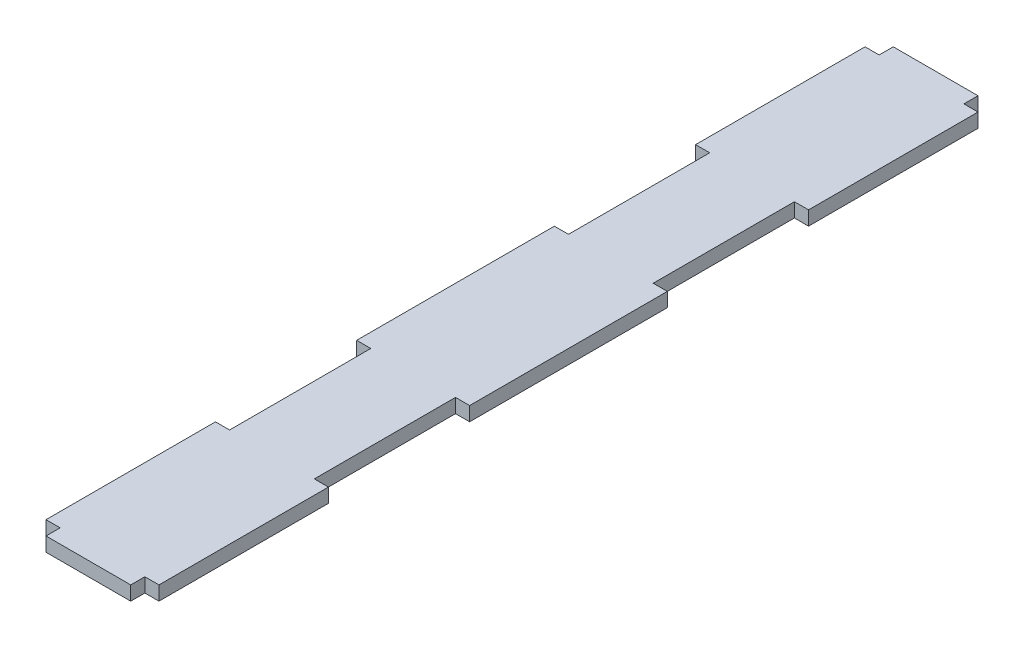
ISO-10303-21;
HEADER;
FILE_DESCRIPTION(('STEP AP214'),'2;1');
FILE_NAME('part.step','',(''),(''),'','','');
FILE_SCHEMA(('AUTOMOTIVE_DESIGN { 1 0 10303 214 1 1 1 1 }'));
ENDSEC;
DATA;
#1=APPLICATION_CONTEXT('core data for automotive mechanical design processes');
#2=APPLICATION_PROTOCOL_DEFINITION('international standard','automotive_design',2000,#1);
#3=PRODUCT_CONTEXT('',#1,'mechanical');
#4=PRODUCT('Part','Part','',(#3));
#5=PRODUCT_RELATED_PRODUCT_CATEGORY('part','',(#4));
#6=PRODUCT_DEFINITION_FORMATION('','',#4);
#7=PRODUCT_DEFINITION_CONTEXT('part definition',#1,'design');
#8=PRODUCT_DEFINITION('design','',#6,#7);
#9=PRODUCT_DEFINITION_SHAPE('','',#8);
#10=(LENGTH_UNIT() NAMED_UNIT(*) SI_UNIT(.MILLI.,.METRE.));
#11=(NAMED_UNIT(*) PLANE_ANGLE_UNIT() SI_UNIT($,.RADIAN.));
#12=(NAMED_UNIT(*) SI_UNIT($,.STERADIAN.) SOLID_ANGLE_UNIT());
#13=UNCERTAINTY_MEASURE_WITH_UNIT(LENGTH_MEASURE(1.E-05),#10,'distance_accuracy_value','');
#14=(GEOMETRIC_REPRESENTATION_CONTEXT(3) GLOBAL_UNCERTAINTY_ASSIGNED_CONTEXT((#13)) GLOBAL_UNIT_ASSIGNED_CONTEXT((#10,
#11,#12)) REPRESENTATION_CONTEXT('',''));
#15=CARTESIAN_POINT('',(0.,0.,0.));
#16=DIRECTION('',(0.,0.,1.));
#17=DIRECTION('',(1.,0.,0.));
#18=AXIS2_PLACEMENT_3D('',#15,#16,#17);
#19=CARTESIAN_POINT('',(0.,5.,0.));
#20=DIRECTION('',(1.,0.,0.));
#21=DIRECTION('',(0.,0.,-1.));
#22=AXIS2_PLACEMENT_3D('',#19,#20,#21);
#23=PLANE('',#22);
#24=DIRECTION('',(0.,0.,1.));
#25=VECTOR('',#24,1.);
#26=CARTESIAN_POINT('',(0.,0.,0.));
#27=LINE('',#26,#25);
#28=CARTESIAN_POINT('',(0.,0.,-60.));
#29=VERTEX_POINT('',#28);
#30=CARTESIAN_POINT('',(0.,0.,0.));
#31=VERTEX_POINT('',#30);
#32=EDGE_CURVE('E253',#29,#31,#27,.T.);
#33=ORIENTED_EDGE('',*,*,#32,.T.);
#34=DIRECTION('',(0.,-1.,0.));
#35=VECTOR('',#34,1.);
#36=CARTESIAN_POINT('',(0.,5.,0.));
#37=LINE('',#36,#35);
#38=CARTESIAN_POINT('',(0.,5.,0.));
#39=VERTEX_POINT('',#38);
#40=EDGE_CURVE('E11',#39,#31,#37,.T.);
#41=ORIENTED_EDGE('',*,*,#40,.F.);
#42=DIRECTION('',(0.,0.,1.));
#43=VECTOR('',#42,1.);
#44=CARTESIAN_POINT('',(0.,5.,0.));
#45=LINE('',#44,#43);
#46=CARTESIAN_POINT('',(0.,5.,-60.));
#47=VERTEX_POINT('',#46);
#48=EDGE_CURVE('E307',#47,#39,#45,.T.);
#49=ORIENTED_EDGE('',*,*,#48,.F.);
#50=DIRECTION('',(0.,-1.,0.));
#51=VECTOR('',#50,1.);
#52=CARTESIAN_POINT('',(0.,5.,-60.));
#53=LINE('',#52,#51);
#54=EDGE_CURVE('E249',#47,#29,#53,.T.);
#55=ORIENTED_EDGE('',*,*,#54,.T.);
#56=EDGE_LOOP('',(#33,#41,#49,#55));
#57=FACE_BOUND('',#56,.T.);
#58=ADVANCED_FACE('F37',(#57),#23,.F.);
#59=CARTESIAN_POINT('',(0.,5.,0.));
#60=DIRECTION('',(0.,0.,-1.));
#61=DIRECTION('',(-1.,0.,0.));
#62=AXIS2_PLACEMENT_3D('',#59,#60,#61);
#63=PLANE('',#62);
#64=DIRECTION('',(1.,0.,0.));
#65=VECTOR('',#64,1.);
#66=CARTESIAN_POINT('',(0.,0.,0.));
#67=LINE('',#66,#65);
#68=CARTESIAN_POINT('',(5.,0.,0.));
#69=VERTEX_POINT('',#68);
#70=EDGE_CURVE('E256',#31,#69,#67,.T.);
#71=ORIENTED_EDGE('',*,*,#70,.T.);
#72=DIRECTION('',(0.,-1.,0.));
#73=VECTOR('',#72,1.);
#74=CARTESIAN_POINT('',(5.,5.,0.));
#75=LINE('',#74,#73);
#76=CARTESIAN_POINT('',(5.,5.,0.));
#77=VERTEX_POINT('',#76);
#78=EDGE_CURVE('E45',#77,#69,#75,.T.);
#79=ORIENTED_EDGE('',*,*,#78,.F.);
#80=DIRECTION('',(1.,0.,0.));
#81=VECTOR('',#80,1.);
#82=CARTESIAN_POINT('',(0.,5.,0.));
#83=LINE('',#82,#81);
#84=EDGE_CURVE('E156',#39,#77,#83,.T.);
#85=ORIENTED_EDGE('',*,*,#84,.F.);
#86=ORIENTED_EDGE('',*,*,#40,.T.);
#87=EDGE_LOOP('',(#71,#79,#85,#86));
#88=FACE_BOUND('',#87,.T.);
#89=ADVANCED_FACE('F465',(#88),#63,.F.);
#90=CARTESIAN_POINT('',(5.,5.,0.));
#91=DIRECTION('',(1.,0.,0.));
#92=DIRECTION('',(0.,0.,-1.));
#93=AXIS2_PLACEMENT_3D('',#90,#91,#92);
#94=PLANE('',#93);
#95=DIRECTION('',(0.,0.,1.));
#96=VECTOR('',#95,1.);
#97=CARTESIAN_POINT('',(5.,0.,0.));
#98=LINE('',#97,#96);
#99=CARTESIAN_POINT('',(5.,0.,5.));
#100=VERTEX_POINT('',#99);
#101=EDGE_CURVE('E258',#69,#100,#98,.T.);
#102=ORIENTED_EDGE('',*,*,#101,.T.);
#103=DIRECTION('',(0.,-1.,0.));
#104=VECTOR('',#103,1.);
#105=CARTESIAN_POINT('',(5.,5.,5.));
#106=LINE('',#105,#104);
#107=CARTESIAN_POINT('',(5.,5.,5.));
#108=VERTEX_POINT('',#107);
#109=EDGE_CURVE('E374',#108,#100,#106,.T.);
#110=ORIENTED_EDGE('',*,*,#109,.F.);
#111=DIRECTION('',(0.,0.,1.));
#112=VECTOR('',#111,1.);
#113=CARTESIAN_POINT('',(5.,5.,0.));
#114=LINE('',#113,#112);
#115=EDGE_CURVE('E382',#77,#108,#114,.T.);
#116=ORIENTED_EDGE('',*,*,#115,.F.);
#117=ORIENTED_EDGE('',*,*,#78,.T.);
#118=EDGE_LOOP('',(#102,#110,#116,#117));
#119=FACE_BOUND('',#118,.T.);
#120=ADVANCED_FACE('F380',(#119),#94,.F.);
#121=CARTESIAN_POINT('',(5.,5.,5.));
#122=DIRECTION('',(0.,0.,-1.));
#123=DIRECTION('',(-1.,0.,0.));
#124=AXIS2_PLACEMENT_3D('',#121,#122,#123);
#125=PLANE('',#124);
#126=DIRECTION('',(1.,0.,0.));
#127=VECTOR('',#126,1.);
#128=CARTESIAN_POINT('',(5.,0.,5.));
#129=LINE('',#128,#127);
#130=CARTESIAN_POINT('',(35.,0.,5.));
#131=VERTEX_POINT('',#130);
#132=EDGE_CURVE('E260',#100,#131,#129,.T.);
#133=ORIENTED_EDGE('',*,*,#132,.T.);
#134=DIRECTION('',(0.,-1.,0.));
#135=VECTOR('',#134,1.);
#136=CARTESIAN_POINT('',(35.,5.,5.));
#137=LINE('',#136,#135);
#138=CARTESIAN_POINT('',(35.,5.,5.));
#139=VERTEX_POINT('',#138);
#140=EDGE_CURVE('E371',#139,#131,#137,.T.);
#141=ORIENTED_EDGE('',*,*,#140,.F.);
#142=DIRECTION('',(1.,0.,0.));
#143=VECTOR('',#142,1.);
#144=CARTESIAN_POINT('',(5.,5.,5.));
#145=LINE('',#144,#143);
#146=EDGE_CURVE('E400',#108,#139,#145,.T.);
#147=ORIENTED_EDGE('',*,*,#146,.F.);
#148=ORIENTED_EDGE('',*,*,#109,.T.);
#149=EDGE_LOOP('',(#133,#141,#147,#148));
#150=FACE_BOUND('',#149,.T.);
#151=ADVANCED_FACE('F391',(#150),#125,.F.);
#152=CARTESIAN_POINT('',(35.,5.,0.));
#153=DIRECTION('',(-1.,0.,0.));
#154=DIRECTION('',(0.,0.,1.));
#155=AXIS2_PLACEMENT_3D('',#152,#153,#154);
#156=PLANE('',#155);
#157=DIRECTION('',(0.,0.,-1.));
#158=VECTOR('',#157,1.);
#159=CARTESIAN_POINT('',(35.,0.,0.));
#160=LINE('',#159,#158);
#161=CARTESIAN_POINT('',(35.,0.,0.));
#162=VERTEX_POINT('',#161);
#163=EDGE_CURVE('E262',#131,#162,#160,.T.);
#164=ORIENTED_EDGE('',*,*,#163,.T.);
#165=DIRECTION('',(0.,-1.,0.));
#166=VECTOR('',#165,1.);
#167=CARTESIAN_POINT('',(35.,5.,0.));
#168=LINE('',#167,#166);
#169=CARTESIAN_POINT('',(35.,5.,0.));
#170=VERTEX_POINT('',#169);
#171=EDGE_CURVE('E368',#170,#162,#168,.T.);
#172=ORIENTED_EDGE('',*,*,#171,.F.);
#173=DIRECTION('',(0.,0.,-1.));
#174=VECTOR('',#173,1.);
#175=CARTESIAN_POINT('',(35.,5.,0.));
#176=LINE('',#175,#174);
#177=EDGE_CURVE('E397',#139,#170,#176,.T.);
#178=ORIENTED_EDGE('',*,*,#177,.F.);
#179=ORIENTED_EDGE('',*,*,#140,.T.);
#180=EDGE_LOOP('',(#164,#172,#178,#179));
#181=FACE_BOUND('',#180,.T.);
#182=ADVANCED_FACE('F395',(#181),#156,.F.);
#183=CARTESIAN_POINT('',(35.,5.,0.));
#184=DIRECTION('',(0.,0.,-1.));
#185=DIRECTION('',(-1.,0.,0.));
#186=AXIS2_PLACEMENT_3D('',#183,#184,#185);
#187=PLANE('',#186);
#188=DIRECTION('',(1.,0.,0.));
#189=VECTOR('',#188,1.);
#190=CARTESIAN_POINT('',(35.,0.,0.));
#191=LINE('',#190,#189);
#192=CARTESIAN_POINT('',(40.,0.,0.));
#193=VERTEX_POINT('',#192);
#194=EDGE_CURVE('E264',#162,#193,#191,.T.);
#195=ORIENTED_EDGE('',*,*,#194,.T.);
#196=DIRECTION('',(0.,-1.,0.));
#197=VECTOR('',#196,1.);
#198=CARTESIAN_POINT('',(40.,5.,0.));
#199=LINE('',#198,#197);
#200=CARTESIAN_POINT('',(40.,5.,0.));
#201=VERTEX_POINT('',#200);
#202=EDGE_CURVE('E365',#201,#193,#199,.T.);
#203=ORIENTED_EDGE('',*,*,#202,.F.);
#204=DIRECTION('',(1.,0.,0.));
#205=VECTOR('',#204,1.);
#206=CARTESIAN_POINT('',(35.,5.,0.));
#207=LINE('',#206,#205);
#208=EDGE_CURVE('E399',#170,#201,#207,.T.);
#209=ORIENTED_EDGE('',*,*,#208,.F.);
#210=ORIENTED_EDGE('',*,*,#171,.T.);
#211=EDGE_LOOP('',(#195,#203,#209,#210));
#212=FACE_BOUND('',#211,.T.);
#213=ADVANCED_FACE('F478',(#212),#187,.F.);
#214=CARTESIAN_POINT('',(40.,5.,0.));
#215=DIRECTION('',(-1.,0.,0.));
#216=DIRECTION('',(0.,0.,1.));
#217=AXIS2_PLACEMENT_3D('',#214,#215,#216);
#218=PLANE('',#217);
#219=DIRECTION('',(0.,0.,-1.));
#220=VECTOR('',#219,1.);
#221=CARTESIAN_POINT('',(40.,0.,0.));
#222=LINE('',#221,#220);
#223=CARTESIAN_POINT('',(40.,0.,-60.));
#224=VERTEX_POINT('',#223);
#225=EDGE_CURVE('E266',#193,#224,#222,.T.);
#226=ORIENTED_EDGE('',*,*,#225,.T.);
#227=DIRECTION('',(0.,-1.,0.));
#228=VECTOR('',#227,1.);
#229=CARTESIAN_POINT('',(40.,5.,-60.));
#230=LINE('',#229,#228);
#231=CARTESIAN_POINT('',(40.,5.,-60.));
#232=VERTEX_POINT('',#231);
#233=EDGE_CURVE('E362',#232,#224,#230,.T.);
#234=ORIENTED_EDGE('',*,*,#233,.F.);
#235=DIRECTION('',(0.,0.,-1.));
#236=VECTOR('',#235,1.);
#237=CARTESIAN_POINT('',(40.,5.,0.));
#238=LINE('',#237,#236);
#239=EDGE_CURVE('E402',#201,#232,#238,.T.);
#240=ORIENTED_EDGE('',*,*,#239,.F.);
#241=ORIENTED_EDGE('',*,*,#202,.T.);
#242=EDGE_LOOP('',(#226,#234,#240,#241));
#243=FACE_BOUND('',#242,.T.);
#244=ADVANCED_FACE('F481',(#243),#218,.F.);
#245=CARTESIAN_POINT('',(40.,5.,-60.));
#246=DIRECTION('',(0.,0.,1.));
#247=DIRECTION('',(1.,0.,0.));
#248=AXIS2_PLACEMENT_3D('',#245,#246,#247);
#249=PLANE('',#248);
#250=DIRECTION('',(-1.,0.,0.));
#251=VECTOR('',#250,1.);
#252=CARTESIAN_POINT('',(40.,0.,-60.));
#253=LINE('',#252,#251);
#254=CARTESIAN_POINT('',(35.,0.,-60.));
#255=VERTEX_POINT('',#254);
#256=EDGE_CURVE('E268',#224,#255,#253,.T.);
#257=ORIENTED_EDGE('',*,*,#256,.T.);
#258=DIRECTION('',(0.,-1.,0.));
#259=VECTOR('',#258,1.);
#260=CARTESIAN_POINT('',(35.,5.,-60.));
#261=LINE('',#260,#259);
#262=CARTESIAN_POINT('',(35.,5.,-60.));
#263=VERTEX_POINT('',#262);
#264=EDGE_CURVE('E359',#263,#255,#261,.T.);
#265=ORIENTED_EDGE('',*,*,#264,.F.);
#266=DIRECTION('',(-1.,0.,0.));
#267=VECTOR('',#266,1.);
#268=CARTESIAN_POINT('',(40.,5.,-60.));
#269=LINE('',#268,#267);
#270=EDGE_CURVE('E408',#232,#263,#269,.T.);
#271=ORIENTED_EDGE('',*,*,#270,.F.);
#272=ORIENTED_EDGE('',*,*,#233,.T.);
#273=EDGE_LOOP('',(#257,#265,#271,#272));
#274=FACE_BOUND('',#273,.T.);
#275=ADVANCED_FACE('F485',(#274),#249,.F.);
#276=CARTESIAN_POINT('',(35.,5.,-110.));
#277=DIRECTION('',(-1.,0.,0.));
#278=DIRECTION('',(0.,0.,1.));
#279=AXIS2_PLACEMENT_3D('',#276,#277,#278);
#280=PLANE('',#279);
#281=DIRECTION('',(0.,0.,-1.));
#282=VECTOR('',#281,1.);
#283=CARTESIAN_POINT('',(35.,0.,-110.));
#284=LINE('',#283,#282);
#285=CARTESIAN_POINT('',(35.,0.,-110.));
#286=VERTEX_POINT('',#285);
#287=EDGE_CURVE('E270',#255,#286,#284,.T.);
#288=ORIENTED_EDGE('',*,*,#287,.T.);
#289=DIRECTION('',(0.,-1.,0.));
#290=VECTOR('',#289,1.);
#291=CARTESIAN_POINT('',(35.,5.,-110.));
#292=LINE('',#291,#290);
#293=CARTESIAN_POINT('',(35.,5.,-110.));
#294=VERTEX_POINT('',#293);
#295=EDGE_CURVE('E356',#294,#286,#292,.T.);
#296=ORIENTED_EDGE('',*,*,#295,.F.);
#297=DIRECTION('',(0.,0.,-1.));
#298=VECTOR('',#297,1.);
#299=CARTESIAN_POINT('',(35.,5.,-110.));
#300=LINE('',#299,#298);
#301=EDGE_CURVE('E410',#263,#294,#300,.T.);
#302=ORIENTED_EDGE('',*,*,#301,.F.);
#303=ORIENTED_EDGE('',*,*,#264,.T.);
#304=EDGE_LOOP('',(#288,#296,#302,#303));
#305=FACE_BOUND('',#304,.T.);
#306=ADVANCED_FACE('F489',(#305),#280,.F.);
#307=CARTESIAN_POINT('',(40.,5.,-110.));
#308=DIRECTION('',(0.,0.,-1.));
#309=DIRECTION('',(-1.,0.,0.));
#310=AXIS2_PLACEMENT_3D('',#307,#308,#309);
#311=PLANE('',#310);
#312=DIRECTION('',(1.,0.,0.));
#313=VECTOR('',#312,1.);
#314=CARTESIAN_POINT('',(40.,0.,-110.));
#315=LINE('',#314,#313);
#316=CARTESIAN_POINT('',(40.,0.,-110.));
#317=VERTEX_POINT('',#316);
#318=EDGE_CURVE('E272',#286,#317,#315,.T.);
#319=ORIENTED_EDGE('',*,*,#318,.T.);
#320=DIRECTION('',(0.,-1.,0.));
#321=VECTOR('',#320,1.);
#322=CARTESIAN_POINT('',(40.,5.,-110.));
#323=LINE('',#322,#321);
#324=CARTESIAN_POINT('',(40.,5.,-110.));
#325=VERTEX_POINT('',#324);
#326=EDGE_CURVE('E353',#325,#317,#323,.T.);
#327=ORIENTED_EDGE('',*,*,#326,.F.);
#328=DIRECTION('',(1.,0.,0.));
#329=VECTOR('',#328,1.);
#330=CARTESIAN_POINT('',(40.,5.,-110.));
#331=LINE('',#330,#329);
#332=EDGE_CURVE('E412',#294,#325,#331,.T.);
#333=ORIENTED_EDGE('',*,*,#332,.F.);
#334=ORIENTED_EDGE('',*,*,#295,.T.);
#335=EDGE_LOOP('',(#319,#327,#333,#334));
#336=FACE_BOUND('',#335,.T.);
#337=ADVANCED_FACE('F493',(#336),#311,.F.);
#338=CARTESIAN_POINT('',(40.,5.,-110.));
#339=DIRECTION('',(-1.,0.,0.));
#340=DIRECTION('',(0.,0.,1.));
#341=AXIS2_PLACEMENT_3D('',#338,#339,#340);
#342=PLANE('',#341);
#343=DIRECTION('',(0.,0.,-1.));
#344=VECTOR('',#343,1.);
#345=CARTESIAN_POINT('',(40.,0.,-110.));
#346=LINE('',#345,#344);
#347=CARTESIAN_POINT('',(40.,0.,-180.));
#348=VERTEX_POINT('',#347);
#349=EDGE_CURVE('E274',#317,#348,#346,.T.);
#350=ORIENTED_EDGE('',*,*,#349,.T.);
#351=DIRECTION('',(0.,-1.,0.));
#352=VECTOR('',#351,1.);
#353=CARTESIAN_POINT('',(40.,5.,-180.));
#354=LINE('',#353,#352);
#355=CARTESIAN_POINT('',(40.,5.,-180.));
#356=VERTEX_POINT('',#355);
#357=EDGE_CURVE('E350',#356,#348,#354,.T.);
#358=ORIENTED_EDGE('',*,*,#357,.F.);
#359=DIRECTION('',(0.,0.,-1.));
#360=VECTOR('',#359,1.);
#361=CARTESIAN_POINT('',(40.,5.,-110.));
#362=LINE('',#361,#360);
#363=EDGE_CURVE('E414',#325,#356,#362,.T.);
#364=ORIENTED_EDGE('',*,*,#363,.F.);
#365=ORIENTED_EDGE('',*,*,#326,.T.);
#366=EDGE_LOOP('',(#350,#358,#364,#365));
#367=FACE_BOUND('',#366,.T.);
#368=ADVANCED_FACE('F497',(#367),#342,.F.);
#369=CARTESIAN_POINT('',(40.,5.,-180.));
#370=DIRECTION('',(0.,0.,1.));
#371=DIRECTION('',(1.,0.,0.));
#372=AXIS2_PLACEMENT_3D('',#369,#370,#371);
#373=PLANE('',#372);
#374=DIRECTION('',(-1.,0.,0.));
#375=VECTOR('',#374,1.);
#376=CARTESIAN_POINT('',(40.,0.,-180.));
#377=LINE('',#376,#375);
#378=CARTESIAN_POINT('',(35.,0.,-180.));
#379=VERTEX_POINT('',#378);
#380=EDGE_CURVE('E276',#348,#379,#377,.T.);
#381=ORIENTED_EDGE('',*,*,#380,.T.);
#382=DIRECTION('',(0.,-1.,0.));
#383=VECTOR('',#382,1.);
#384=CARTESIAN_POINT('',(35.,5.,-180.));
#385=LINE('',#384,#383);
#386=CARTESIAN_POINT('',(35.,5.,-180.));
#387=VERTEX_POINT('',#386);
#388=EDGE_CURVE('E347',#387,#379,#385,.T.);
#389=ORIENTED_EDGE('',*,*,#388,.F.);
#390=DIRECTION('',(-1.,0.,0.));
#391=VECTOR('',#390,1.);
#392=CARTESIAN_POINT('',(40.,5.,-180.));
#393=LINE('',#392,#391);
#394=EDGE_CURVE('E416',#356,#387,#393,.T.);
#395=ORIENTED_EDGE('',*,*,#394,.F.);
#396=ORIENTED_EDGE('',*,*,#357,.T.);
#397=EDGE_LOOP('',(#381,#389,#395,#396));
#398=FACE_BOUND('',#397,.T.);
#399=ADVANCED_FACE('F501',(#398),#373,.F.);
#400=CARTESIAN_POINT('',(35.,5.,-230.));
#401=DIRECTION('',(-1.,0.,0.));
#402=DIRECTION('',(0.,0.,1.));
#403=AXIS2_PLACEMENT_3D('',#400,#401,#402);
#404=PLANE('',#403);
#405=DIRECTION('',(0.,0.,-1.));
#406=VECTOR('',#405,1.);
#407=CARTESIAN_POINT('',(35.,0.,-230.));
#408=LINE('',#407,#406);
#409=CARTESIAN_POINT('',(35.,0.,-230.));
#410=VERTEX_POINT('',#409);
#411=EDGE_CURVE('E278',#379,#410,#408,.T.);
#412=ORIENTED_EDGE('',*,*,#411,.T.);
#413=DIRECTION('',(0.,-1.,0.));
#414=VECTOR('',#413,1.);
#415=CARTESIAN_POINT('',(35.,5.,-230.));
#416=LINE('',#415,#414);
#417=CARTESIAN_POINT('',(35.,5.,-230.));
#418=VERTEX_POINT('',#417);
#419=EDGE_CURVE('E344',#418,#410,#416,.T.);
#420=ORIENTED_EDGE('',*,*,#419,.F.);
#421=DIRECTION('',(0.,0.,-1.));
#422=VECTOR('',#421,1.);
#423=CARTESIAN_POINT('',(35.,5.,-230.));
#424=LINE('',#423,#422);
#425=EDGE_CURVE('E418',#387,#418,#424,.T.);
#426=ORIENTED_EDGE('',*,*,#425,.F.);
#427=ORIENTED_EDGE('',*,*,#388,.T.);
#428=EDGE_LOOP('',(#412,#420,#426,#427));
#429=FACE_BOUND('',#428,.T.);
#430=ADVANCED_FACE('F505',(#429),#404,.F.);
#431=CARTESIAN_POINT('',(40.,5.,-230.));
#432=DIRECTION('',(0.,0.,-1.));
#433=DIRECTION('',(-1.,0.,0.));
#434=AXIS2_PLACEMENT_3D('',#431,#432,#433);
#435=PLANE('',#434);
#436=DIRECTION('',(1.,0.,0.));
#437=VECTOR('',#436,1.);
#438=CARTESIAN_POINT('',(40.,0.,-230.));
#439=LINE('',#438,#437);
#440=CARTESIAN_POINT('',(40.,0.,-230.));
#441=VERTEX_POINT('',#440);
#442=EDGE_CURVE('E280',#410,#441,#439,.T.);
#443=ORIENTED_EDGE('',*,*,#442,.T.);
#444=DIRECTION('',(0.,-1.,0.));
#445=VECTOR('',#444,1.);
#446=CARTESIAN_POINT('',(40.,5.,-230.));
#447=LINE('',#446,#445);
#448=CARTESIAN_POINT('',(40.,5.,-230.));
#449=VERTEX_POINT('',#448);
#450=EDGE_CURVE('E341',#449,#441,#447,.T.);
#451=ORIENTED_EDGE('',*,*,#450,.F.);
#452=DIRECTION('',(1.,0.,0.));
#453=VECTOR('',#452,1.);
#454=CARTESIAN_POINT('',(40.,5.,-230.));
#455=LINE('',#454,#453);
#456=EDGE_CURVE('E420',#418,#449,#455,.T.);
#457=ORIENTED_EDGE('',*,*,#456,.F.);
#458=ORIENTED_EDGE('',*,*,#419,.T.);
#459=EDGE_LOOP('',(#443,#451,#457,#458));
#460=FACE_BOUND('',#459,.T.);
#461=ADVANCED_FACE('F509',(#460),#435,.F.);
#462=CARTESIAN_POINT('',(40.,5.,-230.));
#463=DIRECTION('',(-1.,0.,0.));
#464=DIRECTION('',(0.,0.,1.));
#465=AXIS2_PLACEMENT_3D('',#462,#463,#464);
#466=PLANE('',#465);
#467=DIRECTION('',(0.,0.,-1.));
#468=VECTOR('',#467,1.);
#469=CARTESIAN_POINT('',(40.,0.,-230.));
#470=LINE('',#469,#468);
#471=CARTESIAN_POINT('',(40.,0.,-290.));
#472=VERTEX_POINT('',#471);
#473=EDGE_CURVE('E282',#441,#472,#470,.T.);
#474=ORIENTED_EDGE('',*,*,#473,.T.);
#475=DIRECTION('',(0.,-1.,0.));
#476=VECTOR('',#475,1.);
#477=CARTESIAN_POINT('',(40.,5.,-290.));
#478=LINE('',#477,#476);
#479=CARTESIAN_POINT('',(40.,5.,-290.));
#480=VERTEX_POINT('',#479);
#481=EDGE_CURVE('E338',#480,#472,#478,.T.);
#482=ORIENTED_EDGE('',*,*,#481,.F.);
#483=DIRECTION('',(0.,0.,-1.));
#484=VECTOR('',#483,1.);
#485=CARTESIAN_POINT('',(40.,5.,-230.));
#486=LINE('',#485,#484);
#487=EDGE_CURVE('E422',#449,#480,#486,.T.);
#488=ORIENTED_EDGE('',*,*,#487,.F.);
#489=ORIENTED_EDGE('',*,*,#450,.T.);
#490=EDGE_LOOP('',(#474,#482,#488,#489));
#491=FACE_BOUND('',#490,.T.);
#492=ADVANCED_FACE('F513',(#491),#466,.F.);
#493=CARTESIAN_POINT('',(35.,5.,-290.));
#494=DIRECTION('',(0.,0.,1.));
#495=DIRECTION('',(1.,0.,0.));
#496=AXIS2_PLACEMENT_3D('',#493,#494,#495);
#497=PLANE('',#496);
#498=DIRECTION('',(-1.,0.,0.));
#499=VECTOR('',#498,1.);
#500=CARTESIAN_POINT('',(35.,0.,-290.));
#501=LINE('',#500,#499);
#502=CARTESIAN_POINT('',(35.,0.,-290.));
#503=VERTEX_POINT('',#502);
#504=EDGE_CURVE('E284',#472,#503,#501,.T.);
#505=ORIENTED_EDGE('',*,*,#504,.T.);
#506=DIRECTION('',(0.,-1.,0.));
#507=VECTOR('',#506,1.);
#508=CARTESIAN_POINT('',(35.,5.,-290.));
#509=LINE('',#508,#507);
#510=CARTESIAN_POINT('',(35.,5.,-290.));
#511=VERTEX_POINT('',#510);
#512=EDGE_CURVE('E335',#511,#503,#509,.T.);
#513=ORIENTED_EDGE('',*,*,#512,.F.);
#514=DIRECTION('',(-1.,0.,0.));
#515=VECTOR('',#514,1.);
#516=CARTESIAN_POINT('',(35.,5.,-290.));
#517=LINE('',#516,#515);
#518=EDGE_CURVE('E424',#480,#511,#517,.T.);
#519=ORIENTED_EDGE('',*,*,#518,.F.);
#520=ORIENTED_EDGE('',*,*,#481,.T.);
#521=EDGE_LOOP('',(#505,#513,#519,#520));
#522=FACE_BOUND('',#521,.T.);
#523=ADVANCED_FACE('F517',(#522),#497,.F.);
#524=CARTESIAN_POINT('',(35.,5.,-290.));
#525=DIRECTION('',(-1.,0.,0.));
#526=DIRECTION('',(0.,0.,1.));
#527=AXIS2_PLACEMENT_3D('',#524,#525,#526);
#528=PLANE('',#527);
#529=DIRECTION('',(0.,0.,-1.));
#530=VECTOR('',#529,1.);
#531=CARTESIAN_POINT('',(35.,0.,-290.));
#532=LINE('',#531,#530);
#533=CARTESIAN_POINT('',(35.,0.,-295.));
#534=VERTEX_POINT('',#533);
#535=EDGE_CURVE('E286',#503,#534,#532,.T.);
#536=ORIENTED_EDGE('',*,*,#535,.T.);
#537=DIRECTION('',(0.,-1.,0.));
#538=VECTOR('',#537,1.);
#539=CARTESIAN_POINT('',(35.,5.,-295.));
#540=LINE('',#539,#538);
#541=CARTESIAN_POINT('',(35.,5.,-295.));
#542=VERTEX_POINT('',#541);
#543=EDGE_CURVE('E332',#542,#534,#540,.T.);
#544=ORIENTED_EDGE('',*,*,#543,.F.);
#545=DIRECTION('',(0.,0.,-1.));
#546=VECTOR('',#545,1.);
#547=CARTESIAN_POINT('',(35.,5.,-290.));
#548=LINE('',#547,#546);
#549=EDGE_CURVE('E426',#511,#542,#548,.T.);
#550=ORIENTED_EDGE('',*,*,#549,.F.);
#551=ORIENTED_EDGE('',*,*,#512,.T.);
#552=EDGE_LOOP('',(#536,#544,#550,#551));
#553=FACE_BOUND('',#552,.T.);
#554=ADVANCED_FACE('F521',(#553),#528,.F.);
#555=CARTESIAN_POINT('',(5.,5.,-295.));
#556=DIRECTION('',(0.,0.,1.));
#557=DIRECTION('',(1.,0.,0.));
#558=AXIS2_PLACEMENT_3D('',#555,#556,#557);
#559=PLANE('',#558);
#560=DIRECTION('',(-1.,0.,0.));
#561=VECTOR('',#560,1.);
#562=CARTESIAN_POINT('',(5.,0.,-295.));
#563=LINE('',#562,#561);
#564=CARTESIAN_POINT('',(5.,0.,-295.));
#565=VERTEX_POINT('',#564);
#566=EDGE_CURVE('E288',#534,#565,#563,.T.);
#567=ORIENTED_EDGE('',*,*,#566,.T.);
#568=DIRECTION('',(0.,-1.,0.));
#569=VECTOR('',#568,1.);
#570=CARTESIAN_POINT('',(5.,5.,-295.));
#571=LINE('',#570,#569);
#572=CARTESIAN_POINT('',(5.,5.,-295.));
#573=VERTEX_POINT('',#572);
#574=EDGE_CURVE('E329',#573,#565,#571,.T.);
#575=ORIENTED_EDGE('',*,*,#574,.F.);
#576=DIRECTION('',(-1.,0.,0.));
#577=VECTOR('',#576,1.);
#578=CARTESIAN_POINT('',(5.,5.,-295.));
#579=LINE('',#578,#577);
#580=EDGE_CURVE('E428',#542,#573,#579,.T.);
#581=ORIENTED_EDGE('',*,*,#580,.F.);
#582=ORIENTED_EDGE('',*,*,#543,.T.);
#583=EDGE_LOOP('',(#567,#575,#581,#582));
#584=FACE_BOUND('',#583,.T.);
#585=ADVANCED_FACE('F525',(#584),#559,.F.);
#586=CARTESIAN_POINT('',(5.,5.,-290.));
#587=DIRECTION('',(1.,0.,0.));
#588=DIRECTION('',(0.,0.,-1.));
#589=AXIS2_PLACEMENT_3D('',#586,#587,#588);
#590=PLANE('',#589);
#591=DIRECTION('',(0.,0.,1.));
#592=VECTOR('',#591,1.);
#593=CARTESIAN_POINT('',(5.,0.,-290.));
#594=LINE('',#593,#592);
#595=CARTESIAN_POINT('',(5.,0.,-290.));
#596=VERTEX_POINT('',#595);
#597=EDGE_CURVE('E290',#565,#596,#594,.T.);
#598=ORIENTED_EDGE('',*,*,#597,.T.);
#599=DIRECTION('',(0.,-1.,0.));
#600=VECTOR('',#599,1.);
#601=CARTESIAN_POINT('',(5.,5.,-290.));
#602=LINE('',#601,#600);
#603=CARTESIAN_POINT('',(5.,5.,-290.));
#604=VERTEX_POINT('',#603);
#605=EDGE_CURVE('E326',#604,#596,#602,.T.);
#606=ORIENTED_EDGE('',*,*,#605,.F.);
#607=DIRECTION('',(0.,0.,1.));
#608=VECTOR('',#607,1.);
#609=CARTESIAN_POINT('',(5.,5.,-290.));
#610=LINE('',#609,#608);
#611=EDGE_CURVE('E430',#573,#604,#610,.T.);
#612=ORIENTED_EDGE('',*,*,#611,.F.);
#613=ORIENTED_EDGE('',*,*,#574,.T.);
#614=EDGE_LOOP('',(#598,#606,#612,#613));
#615=FACE_BOUND('',#614,.T.);
#616=ADVANCED_FACE('F529',(#615),#590,.F.);
#617=CARTESIAN_POINT('',(0.,5.,-290.));
#618=DIRECTION('',(0.,0.,1.));
#619=DIRECTION('',(1.,0.,0.));
#620=AXIS2_PLACEMENT_3D('',#617,#618,#619);
#621=PLANE('',#620);
#622=DIRECTION('',(-1.,0.,0.));
#623=VECTOR('',#622,1.);
#624=CARTESIAN_POINT('',(0.,0.,-290.));
#625=LINE('',#624,#623);
#626=CARTESIAN_POINT('',(0.,0.,-290.));
#627=VERTEX_POINT('',#626);
#628=EDGE_CURVE('E292',#596,#627,#625,.T.);
#629=ORIENTED_EDGE('',*,*,#628,.T.);
#630=DIRECTION('',(0.,-1.,0.));
#631=VECTOR('',#630,1.);
#632=CARTESIAN_POINT('',(0.,5.,-290.));
#633=LINE('',#632,#631);
#634=CARTESIAN_POINT('',(0.,5.,-290.));
#635=VERTEX_POINT('',#634);
#636=EDGE_CURVE('E323',#635,#627,#633,.T.);
#637=ORIENTED_EDGE('',*,*,#636,.F.);
#638=DIRECTION('',(-1.,0.,0.));
#639=VECTOR('',#638,1.);
#640=CARTESIAN_POINT('',(0.,5.,-290.));
#641=LINE('',#640,#639);
#642=EDGE_CURVE('E432',#604,#635,#641,.T.);
#643=ORIENTED_EDGE('',*,*,#642,.F.);
#644=ORIENTED_EDGE('',*,*,#605,.T.);
#645=EDGE_LOOP('',(#629,#637,#643,#644));
#646=FACE_BOUND('',#645,.T.);
#647=ADVANCED_FACE('F533',(#646),#621,.F.);
#648=CARTESIAN_POINT('',(0.,5.,-230.));
#649=DIRECTION('',(1.,0.,0.));
#650=DIRECTION('',(0.,0.,-1.));
#651=AXIS2_PLACEMENT_3D('',#648,#649,#650);
#652=PLANE('',#651);
#653=DIRECTION('',(0.,0.,1.));
#654=VECTOR('',#653,1.);
#655=CARTESIAN_POINT('',(0.,0.,-230.));
#656=LINE('',#655,#654);
#657=CARTESIAN_POINT('',(0.,0.,-230.));
#658=VERTEX_POINT('',#657);
#659=EDGE_CURVE('E294',#627,#658,#656,.T.);
#660=ORIENTED_EDGE('',*,*,#659,.T.);
#661=DIRECTION('',(0.,-1.,0.));
#662=VECTOR('',#661,1.);
#663=CARTESIAN_POINT('',(0.,5.,-230.));
#664=LINE('',#663,#662);
#665=CARTESIAN_POINT('',(0.,5.,-230.));
#666=VERTEX_POINT('',#665);
#667=EDGE_CURVE('E320',#666,#658,#664,.T.);
#668=ORIENTED_EDGE('',*,*,#667,.F.);
#669=DIRECTION('',(0.,0.,1.));
#670=VECTOR('',#669,1.);
#671=CARTESIAN_POINT('',(0.,5.,-230.));
#672=LINE('',#671,#670);
#673=EDGE_CURVE('E434',#635,#666,#672,.T.);
#674=ORIENTED_EDGE('',*,*,#673,.F.);
#675=ORIENTED_EDGE('',*,*,#636,.T.);
#676=EDGE_LOOP('',(#660,#668,#674,#675));
#677=FACE_BOUND('',#676,.T.);
#678=ADVANCED_FACE('F537',(#677),#652,.F.);
#679=CARTESIAN_POINT('',(0.,5.,-230.));
#680=DIRECTION('',(0.,0.,-1.));
#681=DIRECTION('',(-1.,0.,0.));
#682=AXIS2_PLACEMENT_3D('',#679,#680,#681);
#683=PLANE('',#682);
#684=DIRECTION('',(1.,0.,0.));
#685=VECTOR('',#684,1.);
#686=CARTESIAN_POINT('',(0.,0.,-230.));
#687=LINE('',#686,#685);
#688=CARTESIAN_POINT('',(5.,0.,-230.));
#689=VERTEX_POINT('',#688);
#690=EDGE_CURVE('E296',#658,#689,#687,.T.);
#691=ORIENTED_EDGE('',*,*,#690,.T.);
#692=DIRECTION('',(0.,-1.,0.));
#693=VECTOR('',#692,1.);
#694=CARTESIAN_POINT('',(5.,5.,-230.));
#695=LINE('',#694,#693);
#696=CARTESIAN_POINT('',(5.,5.,-230.));
#697=VERTEX_POINT('',#696);
#698=EDGE_CURVE('E317',#697,#689,#695,.T.);
#699=ORIENTED_EDGE('',*,*,#698,.F.);
#700=DIRECTION('',(1.,0.,0.));
#701=VECTOR('',#700,1.);
#702=CARTESIAN_POINT('',(0.,5.,-230.));
#703=LINE('',#702,#701);
#704=EDGE_CURVE('E436',#666,#697,#703,.T.);
#705=ORIENTED_EDGE('',*,*,#704,.F.);
#706=ORIENTED_EDGE('',*,*,#667,.T.);
#707=EDGE_LOOP('',(#691,#699,#705,#706));
#708=FACE_BOUND('',#707,.T.);
#709=ADVANCED_FACE('F541',(#708),#683,.F.);
#710=CARTESIAN_POINT('',(5.,5.,-230.));
#711=DIRECTION('',(1.,0.,0.));
#712=DIRECTION('',(0.,0.,-1.));
#713=AXIS2_PLACEMENT_3D('',#710,#711,#712);
#714=PLANE('',#713);
#715=DIRECTION('',(0.,0.,1.));
#716=VECTOR('',#715,1.);
#717=CARTESIAN_POINT('',(5.,0.,-230.));
#718=LINE('',#717,#716);
#719=CARTESIAN_POINT('',(5.00000000000001,0.,-180.));
#720=VERTEX_POINT('',#719);
#721=EDGE_CURVE('E298',#689,#720,#718,.T.);
#722=ORIENTED_EDGE('',*,*,#721,.T.);
#723=DIRECTION('',(0.,-1.,0.));
#724=VECTOR('',#723,1.);
#725=CARTESIAN_POINT('',(5.00000000000001,5.,-180.));
#726=LINE('',#725,#724);
#727=CARTESIAN_POINT('',(5.00000000000001,5.,-180.));
#728=VERTEX_POINT('',#727);
#729=EDGE_CURVE('E314',#728,#720,#726,.T.);
#730=ORIENTED_EDGE('',*,*,#729,.F.);
#731=DIRECTION('',(0.,0.,1.));
#732=VECTOR('',#731,1.);
#733=CARTESIAN_POINT('',(5.,5.,-230.));
#734=LINE('',#733,#732);
#735=EDGE_CURVE('E438',#697,#728,#734,.T.);
#736=ORIENTED_EDGE('',*,*,#735,.F.);
#737=ORIENTED_EDGE('',*,*,#698,.T.);
#738=EDGE_LOOP('',(#722,#730,#736,#737));
#739=FACE_BOUND('',#738,.T.);
#740=ADVANCED_FACE('F545',(#739),#714,.F.);
#741=CARTESIAN_POINT('',(0.,5.,-180.));
#742=DIRECTION('',(0.,0.,1.));
#743=DIRECTION('',(1.,0.,0.));
#744=AXIS2_PLACEMENT_3D('',#741,#742,#743);
#745=PLANE('',#744);
#746=DIRECTION('',(-1.,0.,0.));
#747=VECTOR('',#746,1.);
#748=CARTESIAN_POINT('',(0.,0.,-180.));
#749=LINE('',#748,#747);
#750=CARTESIAN_POINT('',(0.,0.,-180.));
#751=VERTEX_POINT('',#750);
#752=EDGE_CURVE('E300',#720,#751,#749,.T.);
#753=ORIENTED_EDGE('',*,*,#752,.T.);
#754=DIRECTION('',(0.,-1.,0.));
#755=VECTOR('',#754,1.);
#756=CARTESIAN_POINT('',(0.,5.,-180.));
#757=LINE('',#756,#755);
#758=CARTESIAN_POINT('',(0.,5.,-180.));
#759=VERTEX_POINT('',#758);
#760=EDGE_CURVE('E311',#759,#751,#757,.T.);
#761=ORIENTED_EDGE('',*,*,#760,.F.);
#762=DIRECTION('',(-1.,0.,0.));
#763=VECTOR('',#762,1.);
#764=CARTESIAN_POINT('',(0.,5.,-180.));
#765=LINE('',#764,#763);
#766=EDGE_CURVE('E440',#728,#759,#765,.T.);
#767=ORIENTED_EDGE('',*,*,#766,.F.);
#768=ORIENTED_EDGE('',*,*,#729,.T.);
#769=EDGE_LOOP('',(#753,#761,#767,#768));
#770=FACE_BOUND('',#769,.T.);
#771=ADVANCED_FACE('F446',(#770),#745,.F.);
#772=CARTESIAN_POINT('',(0.,5.,-110.));
#773=DIRECTION('',(1.,0.,0.));
#774=DIRECTION('',(0.,0.,-1.));
#775=AXIS2_PLACEMENT_3D('',#772,#773,#774);
#776=PLANE('',#775);
#777=DIRECTION('',(0.,0.,1.));
#778=VECTOR('',#777,1.);
#779=CARTESIAN_POINT('',(0.,0.,-110.));
#780=LINE('',#779,#778);
#781=CARTESIAN_POINT('',(0.,0.,-110.));
#782=VERTEX_POINT('',#781);
#783=EDGE_CURVE('E302',#751,#782,#780,.T.);
#784=ORIENTED_EDGE('',*,*,#783,.T.);
#785=DIRECTION('',(0.,-1.,0.));
#786=VECTOR('',#785,1.);
#787=CARTESIAN_POINT('',(0.,5.,-110.));
#788=LINE('',#787,#786);
#789=CARTESIAN_POINT('',(0.,5.,-110.));
#790=VERTEX_POINT('',#789);
#791=EDGE_CURVE('E244',#790,#782,#788,.T.);
#792=ORIENTED_EDGE('',*,*,#791,.F.);
#793=DIRECTION('',(0.,0.,1.));
#794=VECTOR('',#793,1.);
#795=CARTESIAN_POINT('',(0.,5.,-110.));
#796=LINE('',#795,#794);
#797=EDGE_CURVE('E235',#759,#790,#796,.T.);
#798=ORIENTED_EDGE('',*,*,#797,.F.);
#799=ORIENTED_EDGE('',*,*,#760,.T.);
#800=EDGE_LOOP('',(#784,#792,#798,#799));
#801=FACE_BOUND('',#800,.T.);
#802=ADVANCED_FACE('F450',(#801),#776,.F.);
#803=CARTESIAN_POINT('',(0.,5.,-110.));
#804=DIRECTION('',(0.,0.,-1.));
#805=DIRECTION('',(-1.,0.,0.));
#806=AXIS2_PLACEMENT_3D('',#803,#804,#805);
#807=PLANE('',#806);
#808=DIRECTION('',(1.,0.,0.));
#809=VECTOR('',#808,1.);
#810=CARTESIAN_POINT('',(0.,0.,-110.));
#811=LINE('',#810,#809);
#812=CARTESIAN_POINT('',(5.00000000000001,0.,-110.));
#813=VERTEX_POINT('',#812);
#814=EDGE_CURVE('E243',#782,#813,#811,.T.);
#815=ORIENTED_EDGE('',*,*,#814,.T.);
#816=DIRECTION('',(0.,-1.,0.));
#817=VECTOR('',#816,1.);
#818=CARTESIAN_POINT('',(5.00000000000001,5.,-110.));
#819=LINE('',#818,#817);
#820=CARTESIAN_POINT('',(5.00000000000001,5.,-110.));
#821=VERTEX_POINT('',#820);
#822=EDGE_CURVE('E240',#821,#813,#819,.T.);
#823=ORIENTED_EDGE('',*,*,#822,.F.);
#824=DIRECTION('',(1.,0.,0.));
#825=VECTOR('',#824,1.);
#826=CARTESIAN_POINT('',(0.,5.,-110.));
#827=LINE('',#826,#825);
#828=EDGE_CURVE('E229',#790,#821,#827,.T.);
#829=ORIENTED_EDGE('',*,*,#828,.F.);
#830=ORIENTED_EDGE('',*,*,#791,.T.);
#831=EDGE_LOOP('',(#815,#823,#829,#830));
#832=FACE_BOUND('',#831,.T.);
#833=ADVANCED_FACE('F241',(#832),#807,.F.);
#834=CARTESIAN_POINT('',(5.00000000000001,5.,-110.));
#835=DIRECTION('',(1.,0.,0.));
#836=DIRECTION('',(0.,0.,-1.));
#837=AXIS2_PLACEMENT_3D('',#834,#835,#836);
#838=PLANE('',#837);
#839=DIRECTION('',(0.,0.,1.));
#840=VECTOR('',#839,1.);
#841=CARTESIAN_POINT('',(5.00000000000001,0.,-110.));
#842=LINE('',#841,#840);
#843=CARTESIAN_POINT('',(5.00000000000001,0.,-60.));
#844=VERTEX_POINT('',#843);
#845=EDGE_CURVE('E142',#813,#844,#842,.T.);
#846=ORIENTED_EDGE('',*,*,#845,.T.);
#847=DIRECTION('',(0.,-1.,0.));
#848=VECTOR('',#847,1.);
#849=CARTESIAN_POINT('',(5.00000000000001,5.,-60.));
#850=LINE('',#849,#848);
#851=CARTESIAN_POINT('',(5.00000000000001,5.,-60.));
#852=VERTEX_POINT('',#851);
#853=EDGE_CURVE('E245',#852,#844,#850,.T.);
#854=ORIENTED_EDGE('',*,*,#853,.F.);
#855=DIRECTION('',(0.,0.,1.));
#856=VECTOR('',#855,1.);
#857=CARTESIAN_POINT('',(5.00000000000001,5.,-110.));
#858=LINE('',#857,#856);
#859=EDGE_CURVE('E233',#821,#852,#858,.T.);
#860=ORIENTED_EDGE('',*,*,#859,.F.);
#861=ORIENTED_EDGE('',*,*,#822,.T.);
#862=EDGE_LOOP('',(#846,#854,#860,#861));
#863=FACE_BOUND('',#862,.T.);
#864=ADVANCED_FACE('F247',(#863),#838,.F.);
#865=CARTESIAN_POINT('',(0.,5.,-60.));
#866=DIRECTION('',(0.,0.,1.));
#867=DIRECTION('',(1.,0.,0.));
#868=AXIS2_PLACEMENT_3D('',#865,#866,#867);
#869=PLANE('',#868);
#870=DIRECTION('',(-1.,0.,0.));
#871=VECTOR('',#870,1.);
#872=CARTESIAN_POINT('',(0.,0.,-60.));
#873=LINE('',#872,#871);
#874=EDGE_CURVE('E148',#844,#29,#873,.T.);
#875=ORIENTED_EDGE('',*,*,#874,.T.);
#876=ORIENTED_EDGE('',*,*,#54,.F.);
#877=DIRECTION('',(-1.,0.,0.));
#878=VECTOR('',#877,1.);
#879=CARTESIAN_POINT('',(0.,5.,-60.));
#880=LINE('',#879,#878);
#881=EDGE_CURVE('E53',#852,#47,#880,.T.);
#882=ORIENTED_EDGE('',*,*,#881,.F.);
#883=ORIENTED_EDGE('',*,*,#853,.T.);
#884=EDGE_LOOP('',(#875,#876,#882,#883));
#885=FACE_BOUND('',#884,.T.);
#886=ADVANCED_FACE('F454',(#885),#869,.F.);
#887=CARTESIAN_POINT('',(0.,5.,0.));
#888=DIRECTION('',(0.,-1.,0.));
#889=DIRECTION('',(0.,0.,-1.));
#890=AXIS2_PLACEMENT_3D('',#887,#888,#889);
#891=PLANE('',#890);
#892=ORIENTED_EDGE('',*,*,#48,.T.);
#893=ORIENTED_EDGE('',*,*,#84,.T.);
#894=ORIENTED_EDGE('',*,*,#115,.T.);
#895=ORIENTED_EDGE('',*,*,#146,.T.);
#896=ORIENTED_EDGE('',*,*,#177,.T.);
#897=ORIENTED_EDGE('',*,*,#208,.T.);
#898=ORIENTED_EDGE('',*,*,#239,.T.);
#899=ORIENTED_EDGE('',*,*,#270,.T.);
#900=ORIENTED_EDGE('',*,*,#301,.T.);
#901=ORIENTED_EDGE('',*,*,#332,.T.);
#902=ORIENTED_EDGE('',*,*,#363,.T.);
#903=ORIENTED_EDGE('',*,*,#394,.T.);
#904=ORIENTED_EDGE('',*,*,#425,.T.);
#905=ORIENTED_EDGE('',*,*,#456,.T.);
#906=ORIENTED_EDGE('',*,*,#487,.T.);
#907=ORIENTED_EDGE('',*,*,#518,.T.);
#908=ORIENTED_EDGE('',*,*,#549,.T.);
#909=ORIENTED_EDGE('',*,*,#580,.T.);
#910=ORIENTED_EDGE('',*,*,#611,.T.);
#911=ORIENTED_EDGE('',*,*,#642,.T.);
#912=ORIENTED_EDGE('',*,*,#673,.T.);
#913=ORIENTED_EDGE('',*,*,#704,.T.);
#914=ORIENTED_EDGE('',*,*,#735,.T.);
#915=ORIENTED_EDGE('',*,*,#766,.T.);
#916=ORIENTED_EDGE('',*,*,#797,.T.);
#917=ORIENTED_EDGE('',*,*,#828,.T.);
#918=ORIENTED_EDGE('',*,*,#859,.T.);
#919=ORIENTED_EDGE('',*,*,#881,.T.);
#920=EDGE_LOOP('',(#892,#893,#894,#895,#896,#897,#898,#899,#900,#901,#902,#903,#904,#905,#906,
#907,#908,#909,#910,#911,#912,#913,#914,#915,#916,#917,#918,#919));
#921=FACE_BOUND('',#920,.T.);
#922=ADVANCED_FACE('F231',(#921),#891,.F.);
#923=CARTESIAN_POINT('',(0.,0.,0.));
#924=DIRECTION('',(0.,-1.,0.));
#925=DIRECTION('',(0.,0.,-1.));
#926=AXIS2_PLACEMENT_3D('',#923,#924,#925);
#927=PLANE('',#926);
#928=ORIENTED_EDGE('',*,*,#32,.F.);
#929=ORIENTED_EDGE('',*,*,#874,.F.);
#930=ORIENTED_EDGE('',*,*,#845,.F.);
#931=ORIENTED_EDGE('',*,*,#814,.F.);
#932=ORIENTED_EDGE('',*,*,#783,.F.);
#933=ORIENTED_EDGE('',*,*,#752,.F.);
#934=ORIENTED_EDGE('',*,*,#721,.F.);
#935=ORIENTED_EDGE('',*,*,#690,.F.);
#936=ORIENTED_EDGE('',*,*,#659,.F.);
#937=ORIENTED_EDGE('',*,*,#628,.F.);
#938=ORIENTED_EDGE('',*,*,#597,.F.);
#939=ORIENTED_EDGE('',*,*,#566,.F.);
#940=ORIENTED_EDGE('',*,*,#535,.F.);
#941=ORIENTED_EDGE('',*,*,#504,.F.);
#942=ORIENTED_EDGE('',*,*,#473,.F.);
#943=ORIENTED_EDGE('',*,*,#442,.F.);
#944=ORIENTED_EDGE('',*,*,#411,.F.);
#945=ORIENTED_EDGE('',*,*,#380,.F.);
#946=ORIENTED_EDGE('',*,*,#349,.F.);
#947=ORIENTED_EDGE('',*,*,#318,.F.);
#948=ORIENTED_EDGE('',*,*,#287,.F.);
#949=ORIENTED_EDGE('',*,*,#256,.F.);
#950=ORIENTED_EDGE('',*,*,#225,.F.);
#951=ORIENTED_EDGE('',*,*,#194,.F.);
#952=ORIENTED_EDGE('',*,*,#163,.F.);
#953=ORIENTED_EDGE('',*,*,#132,.F.);
#954=ORIENTED_EDGE('',*,*,#101,.F.);
#955=ORIENTED_EDGE('',*,*,#70,.F.);
#956=EDGE_LOOP('',(#928,#929,#930,#931,#932,#933,#934,#935,#936,#937,#938,#939,#940,#941,#942,
#943,#944,#945,#946,#947,#948,#949,#950,#951,#952,#953,#954,#955));
#957=FACE_BOUND('',#956,.T.);
#958=ADVANCED_FACE('F386',(#957),#927,.T.);
#959=CLOSED_SHELL('',(#58,#89,#120,#151,#182,#213,#244,#275,#306,#337,#368,#399,#430,#461,#492,
#523,#554,#585,#616,#647,#678,#709,#740,#771,#802,#833,#864,#886,#922,#958));
#960=MANIFOLD_SOLID_BREP('B2',#959);
#961=ADVANCED_BREP_SHAPE_REPRESENTATION('',(#18,#960),#14);
#962=SHAPE_DEFINITION_REPRESENTATION(#9,#961);
ENDSEC;
END-ISO-10303-21;
